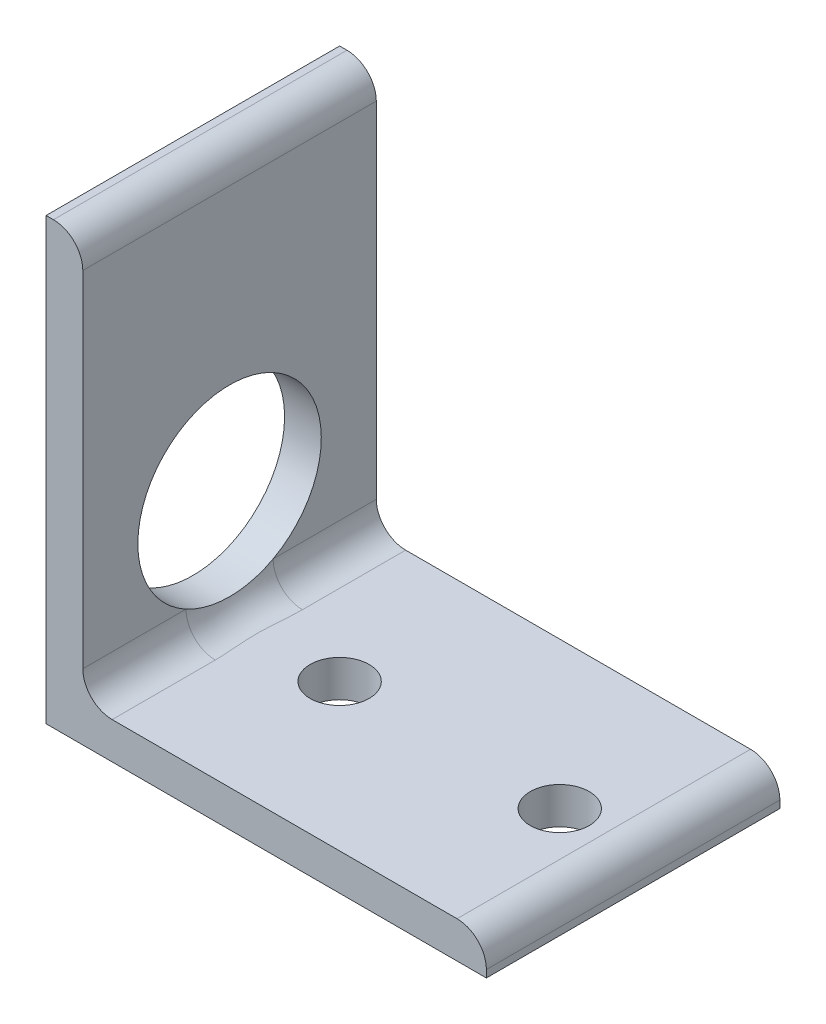
ISO-10303-21;
HEADER;
FILE_DESCRIPTION(('STEP AP214'),'2;1');
FILE_NAME('part.step','',(''),(''),'','','');
FILE_SCHEMA(('AUTOMOTIVE_DESIGN { 1 0 10303 214 1 1 1 1 }'));
ENDSEC;
DATA;
#1=APPLICATION_CONTEXT('core data for automotive mechanical design processes');
#2=APPLICATION_PROTOCOL_DEFINITION('international standard','automotive_design',2000,#1);
#3=PRODUCT_CONTEXT('',#1,'mechanical');
#4=PRODUCT('Part','Part','',(#3));
#5=PRODUCT_RELATED_PRODUCT_CATEGORY('part','',(#4));
#6=PRODUCT_DEFINITION_FORMATION('','',#4);
#7=PRODUCT_DEFINITION_CONTEXT('part definition',#1,'design');
#8=PRODUCT_DEFINITION('design','',#6,#7);
#9=PRODUCT_DEFINITION_SHAPE('','',#8);
#10=(LENGTH_UNIT() NAMED_UNIT(*) SI_UNIT(.MILLI.,.METRE.));
#11=(NAMED_UNIT(*) PLANE_ANGLE_UNIT() SI_UNIT($,.RADIAN.));
#12=(NAMED_UNIT(*) SI_UNIT($,.STERADIAN.) SOLID_ANGLE_UNIT());
#13=UNCERTAINTY_MEASURE_WITH_UNIT(LENGTH_MEASURE(1.E-05),#10,'distance_accuracy_value','');
#14=(GEOMETRIC_REPRESENTATION_CONTEXT(3) GLOBAL_UNCERTAINTY_ASSIGNED_CONTEXT((#13)) GLOBAL_UNIT_ASSIGNED_CONTEXT((#10,
#11,#12)) REPRESENTATION_CONTEXT('',''));
#15=CARTESIAN_POINT('',(0.,0.,0.));
#16=DIRECTION('',(0.,0.,1.));
#17=DIRECTION('',(1.,0.,0.));
#18=AXIS2_PLACEMENT_3D('',#15,#16,#17);
#19=CARTESIAN_POINT('',(38.1,0.,12.7));
#20=DIRECTION('',(0.,1.,0.));
#21=DIRECTION('',(-1.,0.,0.));
#22=AXIS2_PLACEMENT_3D('',#19,#20,#21);
#23=PLANE('',#22);
#24=CARTESIAN_POINT('',(12.7,0.,0.));
#25=DIRECTION('',(0.,1.,0.));
#26=DIRECTION('',(0.,0.,1.));
#27=AXIS2_PLACEMENT_3D('',#24,#25,#26);
#28=CIRCLE('',#27,2.55269999999999);
#29=CARTESIAN_POINT('',(12.7,0.,2.55269999999999));
#30=VERTEX_POINT('',#29);
#31=EDGE_CURVE('E338',#30,#30,#28,.T.);
#32=ORIENTED_EDGE('',*,*,#31,.T.);
#33=EDGE_LOOP('',(#32));
#34=FACE_BOUND('',#33,.T.);
#35=CARTESIAN_POINT('',(31.75,0.,0.));
#36=DIRECTION('',(0.,1.,0.));
#37=DIRECTION('',(0.,0.,1.));
#38=AXIS2_PLACEMENT_3D('',#35,#36,#37);
#39=CIRCLE('',#38,2.5527);
#40=CARTESIAN_POINT('',(31.75,0.,2.5527));
#41=VERTEX_POINT('',#40);
#42=EDGE_CURVE('E218',#41,#41,#39,.T.);
#43=ORIENTED_EDGE('',*,*,#42,.T.);
#44=EDGE_LOOP('',(#43));
#45=FACE_BOUND('',#44,.T.);
#46=DIRECTION('',(1.,0.,0.));
#47=VECTOR('',#46,1.);
#48=CARTESIAN_POINT('',(38.1,0.,-12.7));
#49=LINE('',#48,#47);
#50=CARTESIAN_POINT('',(0.,0.,-12.7));
#51=VERTEX_POINT('',#50);
#52=CARTESIAN_POINT('',(38.1,0.,-12.7));
#53=VERTEX_POINT('',#52);
#54=EDGE_CURVE('E159',#51,#53,#49,.T.);
#55=ORIENTED_EDGE('',*,*,#54,.T.);
#56=DIRECTION('',(0.,0.,-1.));
#57=VECTOR('',#56,1.);
#58=CARTESIAN_POINT('',(38.1,0.,12.7));
#59=LINE('',#58,#57);
#60=CARTESIAN_POINT('',(38.1,0.,12.7));
#61=VERTEX_POINT('',#60);
#62=EDGE_CURVE('E138',#61,#53,#59,.T.);
#63=ORIENTED_EDGE('',*,*,#62,.F.);
#64=DIRECTION('',(1.,0.,0.));
#65=VECTOR('',#64,1.);
#66=CARTESIAN_POINT('',(38.1,0.,12.7));
#67=LINE('',#66,#65);
#68=CARTESIAN_POINT('',(0.,0.,12.7));
#69=VERTEX_POINT('',#68);
#70=EDGE_CURVE('E146',#69,#61,#67,.T.);
#71=ORIENTED_EDGE('',*,*,#70,.F.);
#72=DIRECTION('',(0.,0.,-1.));
#73=VECTOR('',#72,1.);
#74=CARTESIAN_POINT('',(0.,0.,12.7));
#75=LINE('',#74,#73);
#76=EDGE_CURVE('E169',#69,#51,#75,.T.);
#77=ORIENTED_EDGE('',*,*,#76,.T.);
#78=EDGE_LOOP('',(#55,#63,#71,#77));
#79=FACE_BOUND('',#78,.T.);
#80=ADVANCED_FACE('F40',(#34,#45,#79),#23,.F.);
#81=CARTESIAN_POINT('',(38.1,3.175,12.7));
#82=DIRECTION('',(-1.,0.,0.));
#83=DIRECTION('',(0.,0.,1.));
#84=AXIS2_PLACEMENT_3D('',#81,#82,#83);
#85=PLANE('',#84);
#86=DIRECTION('',(0.,1.,0.));
#87=VECTOR('',#86,1.);
#88=CARTESIAN_POINT('',(38.1,3.175,-12.7));
#89=LINE('',#88,#87);
#90=CARTESIAN_POINT('',(38.1,0.635000000000004,-12.7));
#91=VERTEX_POINT('',#90);
#92=EDGE_CURVE('E275',#53,#91,#89,.T.);
#93=ORIENTED_EDGE('',*,*,#92,.T.);
#94=DIRECTION('',(0.,0.,-1.));
#95=VECTOR('',#94,1.);
#96=CARTESIAN_POINT('',(38.1,0.635000000000004,12.7));
#97=LINE('',#96,#95);
#98=CARTESIAN_POINT('',(38.1,0.635000000000004,12.7));
#99=VERTEX_POINT('',#98);
#100=EDGE_CURVE('E141',#91,#99,#97,.F.);
#101=ORIENTED_EDGE('',*,*,#100,.T.);
#102=DIRECTION('',(0.,1.,0.));
#103=VECTOR('',#102,1.);
#104=CARTESIAN_POINT('',(38.1,3.175,12.7));
#105=LINE('',#104,#103);
#106=EDGE_CURVE('E133',#61,#99,#105,.T.);
#107=ORIENTED_EDGE('',*,*,#106,.F.);
#108=ORIENTED_EDGE('',*,*,#62,.T.);
#109=EDGE_LOOP('',(#93,#101,#107,#108));
#110=FACE_BOUND('',#109,.T.);
#111=ADVANCED_FACE('F136',(#110),#85,.F.);
#112=CARTESIAN_POINT('',(3.175,3.175,12.7));
#113=DIRECTION('',(0.,-1.,0.));
#114=DIRECTION('',(0.,0.,-1.));
#115=AXIS2_PLACEMENT_3D('',#112,#113,#114);
#116=PLANE('',#115);
#117=CARTESIAN_POINT('',(12.7,3.175,0.));
#118=DIRECTION('',(0.,1.,0.));
#119=DIRECTION('',(0.,0.,1.));
#120=AXIS2_PLACEMENT_3D('',#117,#118,#119);
#121=CIRCLE('',#120,2.5527);
#122=CARTESIAN_POINT('',(12.7,3.175,2.5527));
#123=VERTEX_POINT('',#122);
#124=EDGE_CURVE('E350',#123,#123,#121,.T.);
#125=ORIENTED_EDGE('',*,*,#124,.F.);
#126=EDGE_LOOP('',(#125));
#127=FACE_BOUND('',#126,.T.);
#128=CARTESIAN_POINT('',(31.75,3.175,0.));
#129=DIRECTION('',(0.,1.,0.));
#130=DIRECTION('',(0.,0.,1.));
#131=AXIS2_PLACEMENT_3D('',#128,#129,#130);
#132=CIRCLE('',#131,2.5527);
#133=CARTESIAN_POINT('',(31.75,3.175,2.5527));
#134=VERTEX_POINT('',#133);
#135=EDGE_CURVE('E343',#134,#134,#132,.T.);
#136=ORIENTED_EDGE('',*,*,#135,.F.);
#137=EDGE_LOOP('',(#136));
#138=FACE_BOUND('',#137,.T.);
#139=DIRECTION('',(-1.,0.,0.));
#140=VECTOR('',#139,1.);
#141=CARTESIAN_POINT('',(3.175,3.175,12.7));
#142=LINE('',#141,#140);
#143=CARTESIAN_POINT('',(35.56,3.175,12.7));
#144=VERTEX_POINT('',#143);
#145=CARTESIAN_POINT('',(5.715,3.175,12.7));
#146=VERTEX_POINT('',#145);
#147=EDGE_CURVE('E145',#144,#146,#142,.T.);
#148=ORIENTED_EDGE('',*,*,#147,.F.);
#149=DIRECTION('',(0.,0.,-1.));
#150=VECTOR('',#149,1.);
#151=CARTESIAN_POINT('',(35.56,3.175,12.7));
#152=LINE('',#151,#150);
#153=CARTESIAN_POINT('',(35.56,3.175,-12.7));
#154=VERTEX_POINT('',#153);
#155=EDGE_CURVE('E249',#144,#154,#152,.T.);
#156=ORIENTED_EDGE('',*,*,#155,.T.);
#157=DIRECTION('',(-1.,0.,0.));
#158=VECTOR('',#157,1.);
#159=CARTESIAN_POINT('',(3.175,3.175,-12.7));
#160=LINE('',#159,#158);
#161=CARTESIAN_POINT('',(5.715,3.175,-12.7));
#162=VERTEX_POINT('',#161);
#163=EDGE_CURVE('E261',#154,#162,#160,.T.);
#164=ORIENTED_EDGE('',*,*,#163,.T.);
#165=DIRECTION('',(0.,0.,-1.));
#166=VECTOR('',#165,1.);
#167=CARTESIAN_POINT('',(5.715,3.175,12.7));
#168=LINE('',#167,#166);
#169=CARTESIAN_POINT('',(5.715,3.175,-3.77010361263452));
#170=VERTEX_POINT('',#169);
#171=EDGE_CURVE('E181',#162,#170,#168,.F.);
#172=ORIENTED_EDGE('',*,*,#171,.T.);
#173=CARTESIAN_POINT('',(3.175,6.47795001347215,4.92848863396767));
#174=CARTESIAN_POINT('',(2.16772732873965,3.175,4.66902723800528));
#175=CARTESIAN_POINT('',(5.52112209880832,3.175,5.5328216335847));
#176=CARTESIAN_POINT('',(3.175,6.40227242206597,4.83294850172561));
#177=CARTESIAN_POINT('',(2.289308019056,3.175,4.64491609692524));
#178=CARTESIAN_POINT('',(5.56605608144472,3.175,5.35810536430558));
#179=CARTESIAN_POINT('',(3.175,6.32499223397861,4.73086332749049));
#180=CARTESIAN_POINT('',(2.40944214333688,3.175,4.59423689047656));
#181=CARTESIAN_POINT('',(5.60155396631537,3.175,5.18131711679667));
#182=CARTESIAN_POINT('',(3.175,6.16954384121096,4.51384468098617));
#183=CARTESIAN_POINT('',(2.63495285726506,3.175,4.45107739662646));
#184=CARTESIAN_POINT('',(5.65677051309769,3.175,4.82596113395872));
#185=CARTESIAN_POINT('',(3.175,6.09138037190797,4.3989637521383));
#186=CARTESIAN_POINT('',(2.74107620357084,3.17500000000001,4.3602179934835));
#187=CARTESIAN_POINT('',(5.67655117590229,3.175,4.64740323246569));
#188=CARTESIAN_POINT('',(3.175,5.93600332728979,4.15607910981898));
#189=CARTESIAN_POINT('',(2.93519343487003,3.175,4.14757939348668));
#190=CARTESIAN_POINT('',(5.70370499560846,3.175,4.28981191961596));
#191=CARTESIAN_POINT('',(3.175,5.8587881891511,4.0281015858455));
#192=CARTESIAN_POINT('',(3.02401849000241,3.175,4.02668476394423));
#193=CARTESIAN_POINT('',(5.71110242022527,3.175,4.11078012859005));
#194=CARTESIAN_POINT('',(3.175,5.70707067775951,3.75856420774605));
#195=CARTESIAN_POINT('',(3.18400051780241,3.175,3.76194175849581));
#196=CARTESIAN_POINT('',(5.71650477456771,3.175,3.75235499865624));
#197=CARTESIAN_POINT('',(3.175,5.63257237108377,3.61698506006776));
#198=CARTESIAN_POINT('',(3.25586556532231,3.175,3.61840569861588));
#199=CARTESIAN_POINT('',(5.71449616349701,3.175,3.57296151036404));
#200=CARTESIAN_POINT('',(3.175,5.4517953190136,3.24488910521936));
#201=CARTESIAN_POINT('',(3.41430790095675,3.175,3.23959213541614));
#202=CARTESIAN_POINT('',(5.70117524177557,3.175,3.12301295173061));
#203=CARTESIAN_POINT('',(3.175,5.34867735833595,3.00582853873119));
#204=CARTESIAN_POINT('',(3.49305094230741,3.175,2.99096230450903));
#205=CARTESIAN_POINT('',(5.68564183044588,3.175,2.85260868798794));
#206=CARTESIAN_POINT('',(3.175,5.16132251497719,2.49903486901855));
#207=CARTESIAN_POINT('',(3.61925442536423,3.175,2.46988435661241));
#208=CARTESIAN_POINT('',(5.64876526848257,3.175,2.31212879378319));
#209=CARTESIAN_POINT('',(3.175,5.0770963629851,2.23128559733096));
#210=CARTESIAN_POINT('',(3.66812659917554,3.175,2.19616699567515));
#211=CARTESIAN_POINT('',(5.62741883116983,3.175,2.04205343631959));
#212=CARTESIAN_POINT('',(3.175,4.9353986172642,1.67259904252389));
#213=CARTESIAN_POINT('',(3.74240804415397,3.175,1.63537583578071));
#214=CARTESIAN_POINT('',(5.58753206257658,3.175,1.50220330364796));
#215=CARTESIAN_POINT('',(3.175,4.87787388981018,1.38170917108321));
#216=CARTESIAN_POINT('',(3.76868341085444,3.175,1.34620288456495));
#217=CARTESIAN_POINT('',(5.56898620843348,3.175,1.23242900644148));
#218=CARTESIAN_POINT('',(3.175,4.79571514492065,0.785229548111513));
#219=CARTESIAN_POINT('',(3.8041842667046,3.17500000000001,0.762067556056725));
#220=CARTESIAN_POINT('',(5.54156512295669,3.175,0.692494236513027));
#221=CARTESIAN_POINT('',(3.175,4.77106047984425,0.479649149695761));
#222=CARTESIAN_POINT('',(3.81379505610999,3.17500000000001,0.464350211102664));
#223=CARTESIAN_POINT('',(5.53268382138788,3.175,0.422334113034535));
#224=CARTESIAN_POINT('',(3.175,4.75768613808812,-0.134770303307796));
#225=CARTESIAN_POINT('',(3.81907551766039,3.175,-0.130153105741516));
#226=CARTESIAN_POINT('',(5.52793490695206,3.175,-0.118769120957159));
#227=CARTESIAN_POINT('',(3.175,4.76905342952797,-0.443615447379839));
#228=CARTESIAN_POINT('',(3.81476549822163,3.175,-0.43000785547419));
#229=CARTESIAN_POINT('',(5.53209878890862,3.175,-0.389712546150798));
#230=CARTESIAN_POINT('',(3.175,4.82644566619831,-1.05083306458572));
#231=CARTESIAN_POINT('',(3.79112843730041,3.175,-1.02087006434297));
#232=CARTESIAN_POINT('',(5.55191804931221,3.175,-0.931268479588796));
#233=CARTESIAN_POINT('',(3.175,4.87248925063237,-1.34919981506587));
#234=CARTESIAN_POINT('',(3.77154658248899,3.175,-1.31481192809097));
#235=CARTESIAN_POINT('',(5.56757960787706,3.175,-1.2018807314366));
#236=CARTESIAN_POINT('',(3.175,4.99393491068404,-1.92549829902813));
#237=CARTESIAN_POINT('',(3.71281327368243,3.17500000000001,-1.88754379210678));
#238=CARTESIAN_POINT('',(5.604554619612,3.175,-1.7431934200826));
#239=CARTESIAN_POINT('',(3.175,5.06939441365652,-2.20338878806355));
#240=CARTESIAN_POINT('',(3.67297944357645,3.175,-2.16872240111646));
#241=CARTESIAN_POINT('',(5.6258791021313,3.175,-2.01389298808492));
#242=CARTESIAN_POINT('',(3.175,5.24219730255122,-2.73174650691636));
#243=CARTESIAN_POINT('',(3.56722537143008,3.175,-2.70792447439599));
#244=CARTESIAN_POINT('',(5.66595716515991,3.175,-2.55543193597812));
#245=CARTESIAN_POINT('',(3.175,5.33953270137188,-2.98222369608825));
#246=CARTESIAN_POINT('',(3.50011587661557,3.175,-2.96758371046391));
#247=CARTESIAN_POINT('',(5.68471167997651,3.175,-2.8262712289362));
#248=CARTESIAN_POINT('',(3.175,5.49276661917093,-3.32780034671991));
#249=CARTESIAN_POINT('',(3.37890955957986,3.175,-3.32070260558683));
#250=CARTESIAN_POINT('',(5.70367599808609,3.175,-3.22431873469218));
#251=CARTESIAN_POINT('',(3.175,5.54316332038035,-3.43467330945408));
#252=CARTESIAN_POINT('',(3.33603241754885,3.175,-3.43080849592657));
#253=CARTESIAN_POINT('',(5.70844365584866,3.175,-3.35128935246504));
#254=CARTESIAN_POINT('',(3.175,5.64623650313028,-3.64165820086225));
#255=CARTESIAN_POINT('',(3.24245956246217,3.175,-3.64215229873325));
#256=CARTESIAN_POINT('',(5.71444085007509,3.175,-3.60523253601755));
#257=CARTESIAN_POINT('',(3.175,5.69891138517091,-3.74177475068551));
#258=CARTESIAN_POINT('',(3.1915453465895,3.17500000000001,-3.74337854016823));
#259=CARTESIAN_POINT('',(5.71567282926693,3.175,-3.73220503981689));
#260=CARTESIAN_POINT('',(3.175,5.80579716778651,-3.93523642557964));
#261=CARTESIAN_POINT('',(3.08146635243097,3.17500000000001,-3.93506325730381));
#262=CARTESIAN_POINT('',(5.71361008709502,3.175,-3.98608187275478));
#263=CARTESIAN_POINT('',(3.175,5.86000745454373,-4.02858420495672));
#264=CARTESIAN_POINT('',(3.02205037693227,3.17500000000001,-4.02542085255757));
#265=CARTESIAN_POINT('',(5.71031715034932,3.175,-4.11298620903435));
#266=CARTESIAN_POINT('',(3.175,5.9693341161598,-4.20870022734011));
#267=CARTESIAN_POINT('',(2.89488876302493,3.175,-4.19314152583241));
#268=CARTESIAN_POINT('',(5.69815790399521,3.175,-4.36669544697866));
#269=CARTESIAN_POINT('',(3.175,6.02445163846251,-4.29545921028081));
#270=CARTESIAN_POINT('',(2.82685969693209,3.175,-4.27027004058772));
#271=CARTESIAN_POINT('',(5.68928390734116,3.175,-4.49349996958034));
#272=CARTESIAN_POINT('',(3.175,6.07962155570512,-4.37886920383738));
#273=CARTESIAN_POINT('',(2.75561621544702,3.175,-4.33844615970948));
#274=CARTESIAN_POINT('',(5.67709684679538,3.175,-4.62003821173811));
#275=(BOUNDED_SURFACE() B_SPLINE_SURFACE(3,2,((#173,#174,#175),(#176,#177,#178),(#179,#180,
#181),(#182,#183,#184),(#185,#186,#187),(#188,#189,#190),(#191,#192,#193),(#194,#195,#196),
(#197,#198,#199),(#200,#201,#202),(#203,#204,#205),(#206,#207,#208),(#209,#210,#211),(#212,#213,
#214),(#215,#216,#217),(#218,#219,#220),(#221,#222,#223),(#224,#225,#226),(#227,#228,#229),
(#230,#231,#232),(#233,#234,#235),(#236,#237,#238),(#239,#240,#241),(#242,#243,#244),(#245,#246,
#247),(#248,#249,#250),(#251,#252,#253),(#254,#255,#256),(#257,#258,#259),(#260,#261,#262),
(#263,#264,#265),(#266,#267,#268),(#269,#270,#271),(#272,#273,#274)),.UNSPECIFIED.,.F.,.F.,
.F.) B_SPLINE_SURFACE_WITH_KNOTS((4,2,2,2,2,2,2,2,2,2,2,2,2,2,2,2,4),(3,3),(0.,
0.540455629450285,1.07876854956732,1.61602528518665,2.15405568559348,2.96638174765407,
3.77916805509174,4.59032997402151,5.40098211345982,6.21359290711578,7.02664080741504,
7.84128399790541,8.65563023607592,9.03677070265039,9.41764778361134,9.7983746904989,
10.179627141618),(0.,1.),
.UNSPECIFIED.) GEOMETRIC_REPRESENTATION_ITEM() RATIONAL_B_SPLINE_SURFACE(((1.,0.591449904450062,
1.),(1.,0.604052391787567,1.),(1.,0.616501520282759,1.),(1.,0.640833491960192,1.),(1.,
0.652718384577511,1.),(1.,0.675742967628756,1.),(1.,0.686884074418016,1.),(1.,0.708290558764093,
1.),(1.,0.71855465214312,1.),(1.,0.742985705090164,1.),(1.,0.756474653923389,1.),(1.,
0.780471921325313,1.),(1.,0.790978546806958,1.),(1.,0.80841910226717,1.),(1.,0.815360130466567,
1.),(1.,0.825219151086069,1.),(1.,0.828139669065327,1.),(1.,0.829727923495018,1.),(1.,
0.828385367553538,1.),(1.,0.821537191178153,1.),(1.,0.816029331803421,1.),(1.,0.801246475235771,
1.),(1.,0.791964107705071,1.),(1.,0.770187684722835,1.),(1.,0.75769480122358,1.),(1.,
0.737420238358356,1.),(1.,0.730667705788814,1.),(1.,0.716648596533998,1.),(1.,0.709382378301515,
1.),(1.,0.694393666507326,1.),(1.,0.686671353977693,1.),(1.,0.670818576169102,1.),(1.,
0.662687562202358,1.),(1.,0.654388342811557,1.))) REPRESENTATION_ITEM('') SURFACE());
#276=CARTESIAN_POINT('',(5.67709684679538,3.175,-4.62003821173811));
#277=CARTESIAN_POINT('',(5.68928390734116,3.175,-4.49349996958034));
#278=CARTESIAN_POINT('',(5.69815790399521,3.175,-4.36669544697866));
#279=CARTESIAN_POINT('',(5.71031715034932,3.175,-4.11298620903435));
#280=CARTESIAN_POINT('',(5.71361008709502,3.175,-3.98608187275478));
#281=CARTESIAN_POINT('',(5.71567282926693,3.175,-3.73220503981689));
#282=CARTESIAN_POINT('',(5.71444085007509,3.175,-3.60523253601755));
#283=CARTESIAN_POINT('',(5.70844365584865,3.175,-3.35128935246504));
#284=CARTESIAN_POINT('',(5.70367599808609,3.175,-3.22431873469218));
#285=CARTESIAN_POINT('',(5.68471167997651,3.175,-2.8262712289362));
#286=CARTESIAN_POINT('',(5.66595716515991,3.175,-2.55543193597812));
#287=CARTESIAN_POINT('',(5.6258791021313,3.175,-2.01389298808492));
#288=CARTESIAN_POINT('',(5.604554619612,3.175,-1.7431934200826));
#289=CARTESIAN_POINT('',(5.56757960787706,3.175,-1.20188073143661));
#290=CARTESIAN_POINT('',(5.55191804931221,3.175,-0.931268479588796));
#291=CARTESIAN_POINT('',(5.53209878890862,3.175,-0.389712546150797));
#292=CARTESIAN_POINT('',(5.52793490695206,3.175,-0.118769120957159));
#293=CARTESIAN_POINT('',(5.53268382138788,3.175,0.422334113034535));
#294=CARTESIAN_POINT('',(5.54156512295669,3.175,0.692494236513027));
#295=CARTESIAN_POINT('',(5.56898620843348,3.175,1.23242900644148));
#296=CARTESIAN_POINT('',(5.58753206257658,3.175,1.50220330364796));
#297=CARTESIAN_POINT('',(5.62741883116983,3.175,2.04205343631959));
#298=CARTESIAN_POINT('',(5.64876526848257,3.175,2.31212879378319));
#299=CARTESIAN_POINT('',(5.68564183044588,3.175,2.85260868798794));
#300=CARTESIAN_POINT('',(5.70117524177557,3.175,3.12301295173061));
#301=CARTESIAN_POINT('',(5.71449616349701,3.175,3.57296151036404));
#302=CARTESIAN_POINT('',(5.71650477456771,3.175,3.75235499865624));
#303=CARTESIAN_POINT('',(5.71110242022527,3.175,4.11078012859005));
#304=CARTESIAN_POINT('',(5.70370499560846,3.175,4.28981191961596));
#305=CARTESIAN_POINT('',(5.67655117590229,3.175,4.64740323246569));
#306=CARTESIAN_POINT('',(5.65677051309769,3.175,4.82596113395872));
#307=CARTESIAN_POINT('',(5.60155396631537,3.175,5.18131711679667));
#308=CARTESIAN_POINT('',(5.56605608144472,3.175,5.35810536430558));
#309=CARTESIAN_POINT('',(5.52112209880832,3.175,5.5328216335847));
#310=B_SPLINE_CURVE_WITH_KNOTS('',3,(#276,#277,#278,#279,#280,#281,#282,#283,#284,#285,#286,
#287,#288,#289,#290,#291,#292,#293,#294,#295,#296,#297,#298,#299,#300,#301,#302,#303,#304,#305,
#306,#307,#308,#309),.UNSPECIFIED.,.F.,.F.,(4,2,2,2,2,2,2,2,2,2,2,2,2,2,2,2,4),(0.,
0.38125245111912,0.761979358006678,1.14285643896763,1.52399690554209,2.33834314371261,
3.15298633420297,3.96603423450224,4.7786450281582,5.58929716759651,6.40045908652627,
7.21324539396395,8.02557145602454,8.56360185643136,9.1008585920507,9.63917151216773,
10.179627141618),.UNSPECIFIED.);
#311=CARTESIAN_POINT('',(5.715,3.175,3.77010361263452));
#312=VERTEX_POINT('',#311);
#313=EDGE_CURVE('E166',#170,#312,#310,.T.);
#314=ORIENTED_EDGE('',*,*,#313,.T.);
#315=DIRECTION('',(0.,0.,-1.));
#316=VECTOR('',#315,1.);
#317=CARTESIAN_POINT('',(5.715,3.175,12.7));
#318=LINE('',#317,#316);
#319=EDGE_CURVE('E161',#312,#146,#318,.F.);
#320=ORIENTED_EDGE('',*,*,#319,.T.);
#321=EDGE_LOOP('',(#148,#156,#164,#172,#314,#320));
#322=FACE_BOUND('',#321,.T.);
#323=ADVANCED_FACE('F183',(#127,#138,#322),#116,.F.);
#324=CARTESIAN_POINT('',(3.175,38.1,12.7));
#325=DIRECTION('',(-1.,0.,0.));
#326=DIRECTION('',(0.,-1.,0.));
#327=AXIS2_PLACEMENT_3D('',#324,#325,#326);
#328=PLANE('',#327);
#329=DIRECTION('',(0.,1.,0.));
#330=VECTOR('',#329,1.);
#331=CARTESIAN_POINT('',(3.175,38.1,12.7));
#332=LINE('',#331,#330);
#333=CARTESIAN_POINT('',(3.175,5.71500000000001,12.7));
#334=VERTEX_POINT('',#333);
#335=CARTESIAN_POINT('',(3.175,35.56,12.7));
#336=VERTEX_POINT('',#335);
#337=EDGE_CURVE('E271',#334,#336,#332,.T.);
#338=ORIENTED_EDGE('',*,*,#337,.F.);
#339=DIRECTION('',(0.,0.,-1.));
#340=VECTOR('',#339,1.);
#341=CARTESIAN_POINT('',(3.175,5.71500000000001,-12.7));
#342=LINE('',#341,#340);
#343=CARTESIAN_POINT('',(3.175,5.71500000000001,3.77010361263452));
#344=VERTEX_POINT('',#343);
#345=EDGE_CURVE('E226',#334,#344,#342,.T.);
#346=ORIENTED_EDGE('',*,*,#345,.T.);
#347=CARTESIAN_POINT('',(3.175,12.7,0.));
#348=DIRECTION('',(-1.,0.,0.));
#349=DIRECTION('',(0.,-1.,0.));
#350=AXIS2_PLACEMENT_3D('',#347,#348,#349);
#351=CIRCLE('',#350,7.93749999999999);
#352=CARTESIAN_POINT('',(3.175,5.71500000000001,-3.77010361263452));
#353=VERTEX_POINT('',#352);
#354=EDGE_CURVE('E266',#344,#353,#351,.T.);
#355=ORIENTED_EDGE('',*,*,#354,.T.);
#356=DIRECTION('',(0.,0.,-1.));
#357=VECTOR('',#356,1.);
#358=CARTESIAN_POINT('',(3.175,5.71500000000001,-12.7));
#359=LINE('',#358,#357);
#360=CARTESIAN_POINT('',(3.175,5.71500000000001,-12.7));
#361=VERTEX_POINT('',#360);
#362=EDGE_CURVE('E230',#353,#361,#359,.T.);
#363=ORIENTED_EDGE('',*,*,#362,.T.);
#364=DIRECTION('',(0.,1.,0.));
#365=VECTOR('',#364,1.);
#366=CARTESIAN_POINT('',(3.175,38.1,-12.7));
#367=LINE('',#366,#365);
#368=CARTESIAN_POINT('',(3.175,35.56,-12.7));
#369=VERTEX_POINT('',#368);
#370=EDGE_CURVE('E294',#361,#369,#367,.T.);
#371=ORIENTED_EDGE('',*,*,#370,.T.);
#372=DIRECTION('',(0.,0.,-1.));
#373=VECTOR('',#372,1.);
#374=CARTESIAN_POINT('',(3.175,35.56,12.7));
#375=LINE('',#374,#373);
#376=EDGE_CURVE('E233',#369,#336,#375,.F.);
#377=ORIENTED_EDGE('',*,*,#376,.T.);
#378=EDGE_LOOP('',(#338,#346,#355,#363,#371,#377));
#379=FACE_BOUND('',#378,.T.);
#380=ADVANCED_FACE('F203',(#379),#328,.F.);
#381=CARTESIAN_POINT('',(0.,38.1,12.7));
#382=DIRECTION('',(0.,-1.,0.));
#383=DIRECTION('',(0.,0.,-1.));
#384=AXIS2_PLACEMENT_3D('',#381,#382,#383);
#385=PLANE('',#384);
#386=DIRECTION('',(-1.,0.,0.));
#387=VECTOR('',#386,1.);
#388=CARTESIAN_POINT('',(0.,38.1,12.7));
#389=LINE('',#388,#387);
#390=CARTESIAN_POINT('',(0.634999999999999,38.1,12.7));
#391=VERTEX_POINT('',#390);
#392=CARTESIAN_POINT('',(0.,38.1,12.7));
#393=VERTEX_POINT('',#392);
#394=EDGE_CURVE('E285',#391,#393,#389,.T.);
#395=ORIENTED_EDGE('',*,*,#394,.F.);
#396=DIRECTION('',(0.,0.,-1.));
#397=VECTOR('',#396,1.);
#398=CARTESIAN_POINT('',(0.634999999999999,38.1,12.7));
#399=LINE('',#398,#397);
#400=CARTESIAN_POINT('',(0.634999999999999,38.1,-12.7));
#401=VERTEX_POINT('',#400);
#402=EDGE_CURVE('E222',#391,#401,#399,.T.);
#403=ORIENTED_EDGE('',*,*,#402,.T.);
#404=DIRECTION('',(-1.,0.,0.));
#405=VECTOR('',#404,1.);
#406=CARTESIAN_POINT('',(0.,38.1,-12.7));
#407=LINE('',#406,#405);
#408=CARTESIAN_POINT('',(0.,38.1,-12.7));
#409=VERTEX_POINT('',#408);
#410=EDGE_CURVE('E298',#401,#409,#407,.T.);
#411=ORIENTED_EDGE('',*,*,#410,.T.);
#412=DIRECTION('',(0.,0.,-1.));
#413=VECTOR('',#412,1.);
#414=CARTESIAN_POINT('',(0.,38.1,12.7));
#415=LINE('',#414,#413);
#416=EDGE_CURVE('E162',#393,#409,#415,.T.);
#417=ORIENTED_EDGE('',*,*,#416,.F.);
#418=EDGE_LOOP('',(#395,#403,#411,#417));
#419=FACE_BOUND('',#418,.T.);
#420=ADVANCED_FACE('F315',(#419),#385,.F.);
#421=CARTESIAN_POINT('',(0.,0.,12.7));
#422=DIRECTION('',(1.,0.,0.));
#423=DIRECTION('',(0.,1.,0.));
#424=AXIS2_PLACEMENT_3D('',#421,#422,#423);
#425=PLANE('',#424);
#426=CARTESIAN_POINT('',(0.,12.7,0.));
#427=DIRECTION('',(-1.,0.,0.));
#428=DIRECTION('',(0.,0.,1.));
#429=AXIS2_PLACEMENT_3D('',#426,#427,#428);
#430=CIRCLE('',#429,7.93749999999999);
#431=CARTESIAN_POINT('',(0.,12.7,7.93749999999999));
#432=VERTEX_POINT('',#431);
#433=EDGE_CURVE('E216',#432,#432,#430,.T.);
#434=ORIENTED_EDGE('',*,*,#433,.F.);
#435=EDGE_LOOP('',(#434));
#436=FACE_BOUND('',#435,.T.);
#437=DIRECTION('',(0.,-1.,0.));
#438=VECTOR('',#437,1.);
#439=CARTESIAN_POINT('',(0.,0.,-12.7));
#440=LINE('',#439,#438);
#441=EDGE_CURVE('E156',#409,#51,#440,.T.);
#442=ORIENTED_EDGE('',*,*,#441,.T.);
#443=ORIENTED_EDGE('',*,*,#76,.F.);
#444=DIRECTION('',(0.,-1.,0.));
#445=VECTOR('',#444,1.);
#446=CARTESIAN_POINT('',(0.,0.,12.7));
#447=LINE('',#446,#445);
#448=EDGE_CURVE('E151',#393,#69,#447,.T.);
#449=ORIENTED_EDGE('',*,*,#448,.F.);
#450=ORIENTED_EDGE('',*,*,#416,.T.);
#451=EDGE_LOOP('',(#442,#443,#449,#450));
#452=FACE_BOUND('',#451,.T.);
#453=ADVANCED_FACE('F318',(#436,#452),#425,.F.);
#454=CARTESIAN_POINT('',(0.,0.,12.7));
#455=DIRECTION('',(0.,0.,-1.));
#456=DIRECTION('',(-1.,0.,0.));
#457=AXIS2_PLACEMENT_3D('',#454,#455,#456);
#458=PLANE('',#457);
#459=ORIENTED_EDGE('',*,*,#106,.T.);
#460=CARTESIAN_POINT('',(35.56,0.635000000000004,12.7));
#461=DIRECTION('',(0.,0.,-1.));
#462=DIRECTION('',(-1.,0.,0.));
#463=AXIS2_PLACEMENT_3D('',#460,#461,#462);
#464=CIRCLE('',#463,2.54);
#465=EDGE_CURVE('E236',#99,#144,#464,.F.);
#466=ORIENTED_EDGE('',*,*,#465,.T.);
#467=ORIENTED_EDGE('',*,*,#147,.T.);
#468=CARTESIAN_POINT('',(5.715,5.71500000000001,12.7));
#469=DIRECTION('',(0.,0.,-1.));
#470=DIRECTION('',(-1.,0.,0.));
#471=AXIS2_PLACEMENT_3D('',#468,#469,#470);
#472=CIRCLE('',#471,2.54);
#473=EDGE_CURVE('E11',#146,#334,#472,.T.);
#474=ORIENTED_EDGE('',*,*,#473,.T.);
#475=ORIENTED_EDGE('',*,*,#337,.T.);
#476=CARTESIAN_POINT('',(0.634999999999999,35.56,12.7));
#477=DIRECTION('',(0.,0.,-1.));
#478=DIRECTION('',(-1.,0.,0.));
#479=AXIS2_PLACEMENT_3D('',#476,#477,#478);
#480=CIRCLE('',#479,2.54);
#481=EDGE_CURVE('E239',#336,#391,#480,.F.);
#482=ORIENTED_EDGE('',*,*,#481,.T.);
#483=ORIENTED_EDGE('',*,*,#394,.T.);
#484=ORIENTED_EDGE('',*,*,#448,.T.);
#485=ORIENTED_EDGE('',*,*,#70,.T.);
#486=EDGE_LOOP('',(#459,#466,#467,#474,#475,#482,#483,#484,#485));
#487=FACE_BOUND('',#486,.T.);
#488=ADVANCED_FACE('F149',(#487),#458,.F.);
#489=CARTESIAN_POINT('',(0.,0.,-12.7));
#490=DIRECTION('',(0.,0.,-1.));
#491=DIRECTION('',(-1.,0.,0.));
#492=AXIS2_PLACEMENT_3D('',#489,#490,#491);
#493=PLANE('',#492);
#494=ORIENTED_EDGE('',*,*,#163,.F.);
#495=CARTESIAN_POINT('',(35.56,0.635000000000004,-12.7));
#496=DIRECTION('',(0.,0.,-1.));
#497=DIRECTION('',(-1.,0.,0.));
#498=AXIS2_PLACEMENT_3D('',#495,#496,#497);
#499=CIRCLE('',#498,2.54);
#500=EDGE_CURVE('E244',#154,#91,#499,.T.);
#501=ORIENTED_EDGE('',*,*,#500,.T.);
#502=ORIENTED_EDGE('',*,*,#92,.F.);
#503=ORIENTED_EDGE('',*,*,#54,.F.);
#504=ORIENTED_EDGE('',*,*,#441,.F.);
#505=ORIENTED_EDGE('',*,*,#410,.F.);
#506=CARTESIAN_POINT('',(0.634999999999999,35.56,-12.7));
#507=DIRECTION('',(0.,0.,-1.));
#508=DIRECTION('',(-1.,0.,0.));
#509=AXIS2_PLACEMENT_3D('',#506,#507,#508);
#510=CIRCLE('',#509,2.54);
#511=EDGE_CURVE('E247',#401,#369,#510,.T.);
#512=ORIENTED_EDGE('',*,*,#511,.T.);
#513=ORIENTED_EDGE('',*,*,#370,.F.);
#514=CARTESIAN_POINT('',(5.715,5.71500000000001,-12.7));
#515=DIRECTION('',(0.,0.,-1.));
#516=DIRECTION('',(-1.,0.,0.));
#517=AXIS2_PLACEMENT_3D('',#514,#515,#516);
#518=CIRCLE('',#517,2.54);
#519=EDGE_CURVE('E56',#361,#162,#518,.F.);
#520=ORIENTED_EDGE('',*,*,#519,.T.);
#521=EDGE_LOOP('',(#494,#501,#502,#503,#504,#505,#512,#513,#520));
#522=FACE_BOUND('',#521,.T.);
#523=ADVANCED_FACE('F306',(#522),#493,.T.);
#524=CARTESIAN_POINT('',(0.,12.7,0.));
#525=DIRECTION('',(-1.,0.,0.));
#526=DIRECTION('',(0.,0.,1.));
#527=AXIS2_PLACEMENT_3D('',#524,#525,#526);
#528=CYLINDRICAL_SURFACE('',#527,7.93749999999999);
#529=ORIENTED_EDGE('',*,*,#433,.T.);
#530=EDGE_LOOP('',(#529));
#531=FACE_BOUND('',#530,.T.);
#532=ORIENTED_EDGE('',*,*,#354,.F.);
#533=EDGE_CURVE('E63',#353,#344,#351,.T.);
#534=ORIENTED_EDGE('',*,*,#533,.F.);
#535=EDGE_LOOP('',(#532,#534));
#536=FACE_BOUND('',#535,.T.);
#537=ADVANCED_FACE('F206',(#531,#536),#528,.F.);
#538=CARTESIAN_POINT('',(35.56,0.635000000000004,12.7));
#539=DIRECTION('',(0.,0.,-1.));
#540=DIRECTION('',(-1.,0.,0.));
#541=AXIS2_PLACEMENT_3D('',#538,#539,#540);
#542=CYLINDRICAL_SURFACE('',#541,2.54);
#543=ORIENTED_EDGE('',*,*,#465,.F.);
#544=ORIENTED_EDGE('',*,*,#100,.F.);
#545=ORIENTED_EDGE('',*,*,#500,.F.);
#546=ORIENTED_EDGE('',*,*,#155,.F.);
#547=EDGE_LOOP('',(#543,#544,#545,#546));
#548=FACE_BOUND('',#547,.T.);
#549=ADVANCED_FACE('F191',(#548),#542,.T.);
#550=CARTESIAN_POINT('',(5.715,5.71500000000001,12.7));
#551=DIRECTION('',(0.,0.,1.));
#552=DIRECTION('',(1.,0.,0.));
#553=AXIS2_PLACEMENT_3D('',#550,#551,#552);
#554=CYLINDRICAL_SURFACE('',#553,2.54);
#555=ORIENTED_EDGE('',*,*,#519,.F.);
#556=ORIENTED_EDGE('',*,*,#362,.F.);
#557=CARTESIAN_POINT('',(5.715,5.71500000000001,-3.77010361263452));
#558=DIRECTION('',(0.,0.,-1.));
#559=DIRECTION('',(-1.,0.,0.));
#560=AXIS2_PLACEMENT_3D('',#557,#558,#559);
#561=CIRCLE('',#560,2.54);
#562=EDGE_CURVE('E212',#170,#353,#561,.T.);
#563=ORIENTED_EDGE('',*,*,#562,.F.);
#564=ORIENTED_EDGE('',*,*,#171,.F.);
#565=EDGE_LOOP('',(#555,#556,#563,#564));
#566=FACE_BOUND('',#565,.T.);
#567=ADVANCED_FACE('F198',(#566),#554,.F.);
#568=ORIENTED_EDGE('',*,*,#562,.T.);
#569=ORIENTED_EDGE('',*,*,#533,.T.);
#570=CARTESIAN_POINT('',(5.715,5.71500000000001,3.77010361263452));
#571=DIRECTION('',(0.,0.,1.));
#572=DIRECTION('',(1.,0.,0.));
#573=AXIS2_PLACEMENT_3D('',#570,#571,#572);
#574=CIRCLE('',#573,2.54);
#575=EDGE_CURVE('E71',#312,#344,#574,.F.);
#576=ORIENTED_EDGE('',*,*,#575,.F.);
#577=ORIENTED_EDGE('',*,*,#313,.F.);
#578=EDGE_LOOP('',(#568,#569,#576,#577));
#579=FACE_BOUND('',#578,.T.);
#580=ADVANCED_FACE('F193',(#579),#275,.F.);
#581=CARTESIAN_POINT('',(5.715,5.71500000000001,12.7));
#582=DIRECTION('',(0.,0.,1.));
#583=DIRECTION('',(1.,0.,0.));
#584=AXIS2_PLACEMENT_3D('',#581,#582,#583);
#585=CYLINDRICAL_SURFACE('',#584,2.54);
#586=ORIENTED_EDGE('',*,*,#473,.F.);
#587=ORIENTED_EDGE('',*,*,#319,.F.);
#588=ORIENTED_EDGE('',*,*,#575,.T.);
#589=ORIENTED_EDGE('',*,*,#345,.F.);
#590=EDGE_LOOP('',(#586,#587,#588,#589));
#591=FACE_BOUND('',#590,.T.);
#592=ADVANCED_FACE('F197',(#591),#585,.F.);
#593=CARTESIAN_POINT('',(0.634999999999999,35.56,12.7));
#594=DIRECTION('',(0.,0.,-1.));
#595=DIRECTION('',(-1.,0.,0.));
#596=AXIS2_PLACEMENT_3D('',#593,#594,#595);
#597=CYLINDRICAL_SURFACE('',#596,2.54);
#598=ORIENTED_EDGE('',*,*,#481,.F.);
#599=ORIENTED_EDGE('',*,*,#376,.F.);
#600=ORIENTED_EDGE('',*,*,#511,.F.);
#601=ORIENTED_EDGE('',*,*,#402,.F.);
#602=EDGE_LOOP('',(#598,#599,#600,#601));
#603=FACE_BOUND('',#602,.T.);
#604=ADVANCED_FACE('F42',(#603),#597,.T.);
#605=CARTESIAN_POINT('',(31.75,3.175,0.));
#606=DIRECTION('',(0.,1.,0.));
#607=DIRECTION('',(0.,0.,1.));
#608=AXIS2_PLACEMENT_3D('',#605,#606,#607);
#609=CYLINDRICAL_SURFACE('',#608,2.5527);
#610=ORIENTED_EDGE('',*,*,#42,.F.);
#611=EDGE_LOOP('',(#610));
#612=FACE_BOUND('',#611,.T.);
#613=ORIENTED_EDGE('',*,*,#135,.T.);
#614=EDGE_LOOP('',(#613));
#615=FACE_BOUND('',#614,.T.);
#616=ADVANCED_FACE('F360',(#612,#615),#609,.F.);
#617=CARTESIAN_POINT('',(12.7,3.175,0.));
#618=DIRECTION('',(0.,1.,0.));
#619=DIRECTION('',(0.,0.,1.));
#620=AXIS2_PLACEMENT_3D('',#617,#618,#619);
#621=CYLINDRICAL_SURFACE('',#620,2.5527);
#622=ORIENTED_EDGE('',*,*,#31,.F.);
#623=EDGE_LOOP('',(#622));
#624=FACE_BOUND('',#623,.T.);
#625=ORIENTED_EDGE('',*,*,#124,.T.);
#626=EDGE_LOOP('',(#625));
#627=FACE_BOUND('',#626,.T.);
#628=ADVANCED_FACE('F355',(#624,#627),#621,.F.);
#629=CLOSED_SHELL('',(#80,#111,#323,#380,#420,#453,#488,#523,#537,#549,#567,#580,#592,#604,#616,#628));
#630=MANIFOLD_SOLID_BREP('B2',#629);
#631=ADVANCED_BREP_SHAPE_REPRESENTATION('',(#18,#630),#14);
#632=SHAPE_DEFINITION_REPRESENTATION(#9,#631);
ENDSEC;
END-ISO-10303-21;
